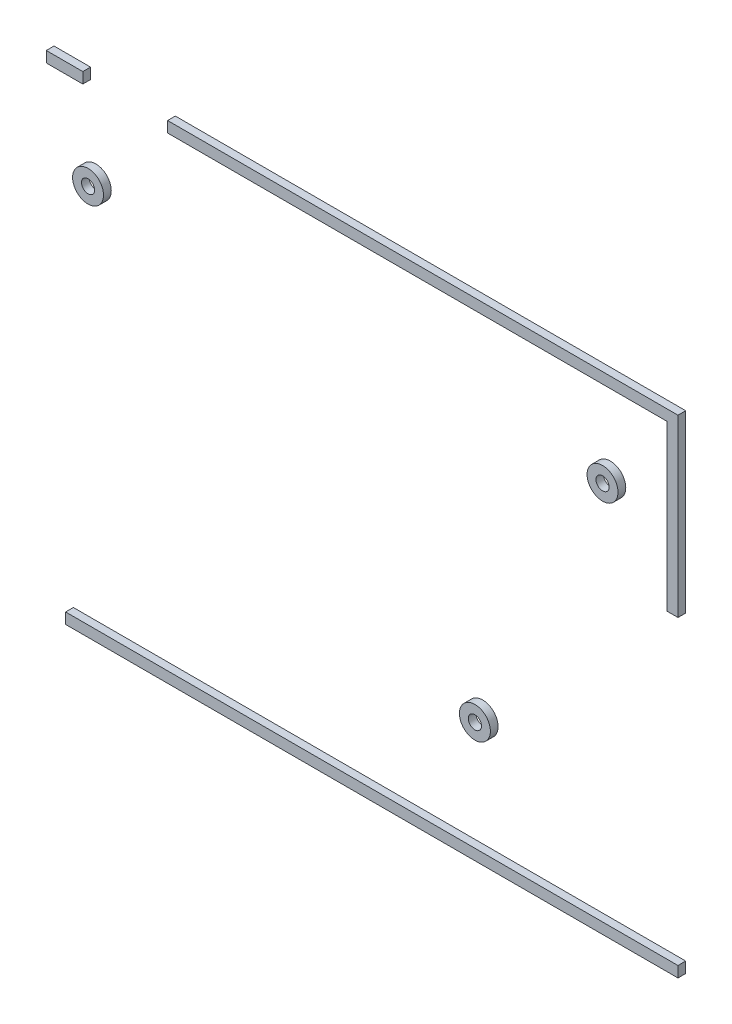
ISO-10303-21;
HEADER;
FILE_DESCRIPTION(('STEP AP214'),'2;1');
FILE_NAME('part.step','',(''),(''),'','','');
FILE_SCHEMA(('AUTOMOTIVE_DESIGN { 1 0 10303 214 1 1 1 1 }'));
ENDSEC;
DATA;
#1=APPLICATION_CONTEXT('core data for automotive mechanical design processes');
#2=APPLICATION_PROTOCOL_DEFINITION('international standard','automotive_design',2000,#1);
#3=PRODUCT_CONTEXT('',#1,'mechanical');
#4=PRODUCT('Part','Part','',(#3));
#5=PRODUCT_RELATED_PRODUCT_CATEGORY('part','',(#4));
#6=PRODUCT_DEFINITION_FORMATION('','',#4);
#7=PRODUCT_DEFINITION_CONTEXT('part definition',#1,'design');
#8=PRODUCT_DEFINITION('design','',#6,#7);
#9=PRODUCT_DEFINITION_SHAPE('','',#8);
#10=(LENGTH_UNIT() NAMED_UNIT(*) SI_UNIT(.MILLI.,.METRE.));
#11=(NAMED_UNIT(*) PLANE_ANGLE_UNIT() SI_UNIT($,.RADIAN.));
#12=(NAMED_UNIT(*) SI_UNIT($,.STERADIAN.) SOLID_ANGLE_UNIT());
#13=UNCERTAINTY_MEASURE_WITH_UNIT(LENGTH_MEASURE(1.E-05),#10,'distance_accuracy_value','');
#14=(GEOMETRIC_REPRESENTATION_CONTEXT(3) GLOBAL_UNCERTAINTY_ASSIGNED_CONTEXT((#13)) GLOBAL_UNIT_ASSIGNED_CONTEXT((#10,
#11,#12)) REPRESENTATION_CONTEXT('',''));
#15=CARTESIAN_POINT('',(0.,0.,0.));
#16=DIRECTION('',(0.,0.,1.));
#17=DIRECTION('',(1.,0.,0.));
#18=AXIS2_PLACEMENT_3D('',#15,#16,#17);
#19=CARTESIAN_POINT('',(176.,0.,160.32476117146));
#20=DIRECTION('',(1.,0.,0.));
#21=DIRECTION('',(0.,0.,-1.));
#22=AXIS2_PLACEMENT_3D('',#19,#20,#21);
#23=PLANE('',#22);
#24=DIRECTION('',(0.,0.,-1.));
#25=VECTOR('',#24,1.);
#26=CARTESIAN_POINT('',(176.,-60.2,160.32476117146));
#27=LINE('',#26,#25);
#28=CARTESIAN_POINT('',(176.,-60.2,2.));
#29=VERTEX_POINT('',#28);
#30=CARTESIAN_POINT('',(176.,-60.2,0.));
#31=VERTEX_POINT('',#30);
#32=EDGE_CURVE('E109',#29,#31,#27,.T.);
#33=ORIENTED_EDGE('',*,*,#32,.F.);
#34=DIRECTION('',(0.,1.,0.));
#35=VECTOR('',#34,1.);
#36=CARTESIAN_POINT('',(176.,0.,2.));
#37=LINE('',#36,#35);
#38=CARTESIAN_POINT('',(176.,-63.,2.));
#39=VERTEX_POINT('',#38);
#40=EDGE_CURVE('E68',#29,#39,#37,.F.);
#41=ORIENTED_EDGE('',*,*,#40,.T.);
#42=DIRECTION('',(0.,0.,-1.));
#43=VECTOR('',#42,1.);
#44=CARTESIAN_POINT('',(176.,-63.,160.32476117146));
#45=LINE('',#44,#43);
#46=CARTESIAN_POINT('',(176.,-63.,0.));
#47=VERTEX_POINT('',#46);
#48=EDGE_CURVE('E107',#39,#47,#45,.T.);
#49=ORIENTED_EDGE('',*,*,#48,.T.);
#50=DIRECTION('',(0.,-1.,0.));
#51=VECTOR('',#50,1.);
#52=CARTESIAN_POINT('',(176.,0.,0.));
#53=LINE('',#52,#51);
#54=EDGE_CURVE('E123',#31,#47,#53,.T.);
#55=ORIENTED_EDGE('',*,*,#54,.F.);
#56=EDGE_LOOP('',(#33,#41,#49,#55));
#57=FACE_BOUND('',#56,.T.);
#58=ADVANCED_FACE('F64',(#57),#23,.T.);
#59=CARTESIAN_POINT('',(0.,-60.2,160.32476117146));
#60=DIRECTION('',(0.,1.,0.));
#61=DIRECTION('',(0.,0.,1.));
#62=AXIS2_PLACEMENT_3D('',#59,#60,#61);
#63=PLANE('',#62);
#64=DIRECTION('',(0.,0.,-1.));
#65=VECTOR('',#64,1.);
#66=CARTESIAN_POINT('',(17.7,-60.2,160.32476117146));
#67=LINE('',#66,#65);
#68=CARTESIAN_POINT('',(17.7,-60.2,2.));
#69=VERTEX_POINT('',#68);
#70=CARTESIAN_POINT('',(17.7,-60.2,0.));
#71=VERTEX_POINT('',#70);
#72=EDGE_CURVE('E133',#69,#71,#67,.T.);
#73=ORIENTED_EDGE('',*,*,#72,.F.);
#74=DIRECTION('',(1.,0.,0.));
#75=VECTOR('',#74,1.);
#76=CARTESIAN_POINT('',(0.,-60.2,2.));
#77=LINE('',#76,#75);
#78=EDGE_CURVE('E83',#69,#29,#77,.T.);
#79=ORIENTED_EDGE('',*,*,#78,.T.);
#80=ORIENTED_EDGE('',*,*,#32,.T.);
#81=DIRECTION('',(1.,0.,0.));
#82=VECTOR('',#81,1.);
#83=CARTESIAN_POINT('',(0.,-60.2,0.));
#84=LINE('',#83,#82);
#85=EDGE_CURVE('E121',#71,#31,#84,.T.);
#86=ORIENTED_EDGE('',*,*,#85,.F.);
#87=EDGE_LOOP('',(#73,#79,#80,#86));
#88=FACE_BOUND('',#87,.T.);
#89=ADVANCED_FACE('F136',(#88),#63,.T.);
#90=CARTESIAN_POINT('',(17.7,0.,160.32476117146));
#91=DIRECTION('',(1.,0.,0.));
#92=DIRECTION('',(0.,0.,-1.));
#93=AXIS2_PLACEMENT_3D('',#90,#91,#92);
#94=PLANE('',#93);
#95=DIRECTION('',(0.,-1.,0.));
#96=VECTOR('',#95,1.);
#97=CARTESIAN_POINT('',(17.7,0.,2.));
#98=LINE('',#97,#96);
#99=CARTESIAN_POINT('',(17.7,-63.,2.));
#100=VERTEX_POINT('',#99);
#101=EDGE_CURVE('E75',#69,#100,#98,.T.);
#102=ORIENTED_EDGE('',*,*,#101,.F.);
#103=ORIENTED_EDGE('',*,*,#72,.T.);
#104=DIRECTION('',(0.,-1.,0.));
#105=VECTOR('',#104,1.);
#106=CARTESIAN_POINT('',(17.7,0.,0.));
#107=LINE('',#106,#105);
#108=CARTESIAN_POINT('',(17.7,-63.,0.));
#109=VERTEX_POINT('',#108);
#110=EDGE_CURVE('E130',#71,#109,#107,.T.);
#111=ORIENTED_EDGE('',*,*,#110,.T.);
#112=DIRECTION('',(0.,0.,-1.));
#113=VECTOR('',#112,1.);
#114=CARTESIAN_POINT('',(17.7,-63.,160.32476117146));
#115=LINE('',#114,#113);
#116=EDGE_CURVE('E118',#100,#109,#115,.T.);
#117=ORIENTED_EDGE('',*,*,#116,.F.);
#118=EDGE_LOOP('',(#102,#103,#111,#117));
#119=FACE_BOUND('',#118,.T.);
#120=ADVANCED_FACE('F140',(#119),#94,.F.);
#121=CARTESIAN_POINT('',(0.,-63.,160.32476117146));
#122=DIRECTION('',(0.,1.,0.));
#123=DIRECTION('',(0.,0.,1.));
#124=AXIS2_PLACEMENT_3D('',#121,#122,#123);
#125=PLANE('',#124);
#126=DIRECTION('',(1.,0.,0.));
#127=VECTOR('',#126,1.);
#128=CARTESIAN_POINT('',(-0.103234931084,-63.,1.99999999999999));
#129=LINE('',#128,#127);
#130=EDGE_CURVE('E13',#100,#39,#129,.T.);
#131=ORIENTED_EDGE('',*,*,#130,.F.);
#132=ORIENTED_EDGE('',*,*,#116,.T.);
#133=DIRECTION('',(1.,0.,0.));
#134=VECTOR('',#133,1.);
#135=CARTESIAN_POINT('',(0.,-63.,0.));
#136=LINE('',#135,#134);
#137=EDGE_CURVE('E113',#109,#47,#136,.T.);
#138=ORIENTED_EDGE('',*,*,#137,.T.);
#139=ORIENTED_EDGE('',*,*,#48,.F.);
#140=EDGE_LOOP('',(#131,#132,#138,#139));
#141=FACE_BOUND('',#140,.T.);
#142=ADVANCED_FACE('F111',(#141),#125,.F.);
#143=CARTESIAN_POINT('',(0.,0.,0.));
#144=DIRECTION('',(0.,0.,1.));
#145=DIRECTION('',(1.,0.,0.));
#146=AXIS2_PLACEMENT_3D('',#143,#144,#145);
#147=PLANE('',#146);
#148=ORIENTED_EDGE('',*,*,#54,.T.);
#149=ORIENTED_EDGE('',*,*,#137,.F.);
#150=ORIENTED_EDGE('',*,*,#110,.F.);
#151=ORIENTED_EDGE('',*,*,#85,.T.);
#152=EDGE_LOOP('',(#148,#149,#150,#151));
#153=FACE_BOUND('',#152,.T.);
#154=ADVANCED_FACE('F137',(#153),#147,.F.);
#155=CARTESIAN_POINT('',(-0.103234931084,0.02377597202222,1.99999999999999));
#156=DIRECTION('',(0.,0.,1.));
#157=DIRECTION('',(1.,0.,0.));
#158=AXIS2_PLACEMENT_3D('',#155,#156,#157);
#159=PLANE('',#158);
#160=ORIENTED_EDGE('',*,*,#101,.T.);
#161=ORIENTED_EDGE('',*,*,#130,.T.);
#162=ORIENTED_EDGE('',*,*,#40,.F.);
#163=ORIENTED_EDGE('',*,*,#78,.F.);
#164=EDGE_LOOP('',(#160,#161,#162,#163));
#165=FACE_BOUND('',#164,.T.);
#166=ADVANCED_FACE('F66',(#165),#159,.T.);
#167=CLOSED_SHELL('',(#58,#89,#120,#142,#154,#166));
#168=MANIFOLD_SOLID_BREP('B2',#167);
#169=CARTESIAN_POINT('',(123.5,-32.,160.32476117146));
#170=DIRECTION('',(0.,0.,-1.));
#171=DIRECTION('',(-1.,0.,0.));
#172=AXIS2_PLACEMENT_3D('',#169,#170,#171);
#173=CYLINDRICAL_SURFACE('',#172,1.70000000000001);
#174=CARTESIAN_POINT('',(123.5,-32.,0.));
#175=DIRECTION('',(0.,0.,1.));
#176=DIRECTION('',(1.,0.,0.));
#177=AXIS2_PLACEMENT_3D('',#174,#175,#176);
#178=CIRCLE('',#177,1.70000000000001);
#179=CARTESIAN_POINT('',(125.2,-32.,0.));
#180=VERTEX_POINT('',#179);
#181=EDGE_CURVE('E210',#180,#180,#178,.T.);
#182=ORIENTED_EDGE('',*,*,#181,.F.);
#183=EDGE_LOOP('',(#182));
#184=FACE_BOUND('',#183,.T.);
#185=CARTESIAN_POINT('',(123.5,-32.,2.));
#186=DIRECTION('',(0.,0.,1.));
#187=DIRECTION('',(1.,0.,0.));
#188=AXIS2_PLACEMENT_3D('',#185,#186,#187);
#189=CIRCLE('',#188,1.70000000000001);
#190=CARTESIAN_POINT('',(125.2,-32.,2.));
#191=VERTEX_POINT('',#190);
#192=EDGE_CURVE('E219',#191,#191,#189,.T.);
#193=ORIENTED_EDGE('',*,*,#192,.T.);
#194=EDGE_LOOP('',(#193));
#195=FACE_BOUND('',#194,.T.);
#196=ADVANCED_FACE('F203',(#184,#195),#173,.F.);
#197=CARTESIAN_POINT('',(123.5,-32.,160.32476117146));
#198=DIRECTION('',(0.,0.,-1.));
#199=DIRECTION('',(-1.,0.,0.));
#200=AXIS2_PLACEMENT_3D('',#197,#198,#199);
#201=CYLINDRICAL_SURFACE('',#200,3.99999999999999);
#202=CARTESIAN_POINT('',(123.5,-32.,0.));
#203=DIRECTION('',(0.,0.,1.));
#204=DIRECTION('',(1.,0.,0.));
#205=AXIS2_PLACEMENT_3D('',#202,#203,#204);
#206=CIRCLE('',#205,3.99999999999999);
#207=CARTESIAN_POINT('',(127.5,-32.,0.));
#208=VERTEX_POINT('',#207);
#209=EDGE_CURVE('E214',#208,#208,#206,.T.);
#210=ORIENTED_EDGE('',*,*,#209,.T.);
#211=EDGE_LOOP('',(#210));
#212=FACE_BOUND('',#211,.T.);
#213=CARTESIAN_POINT('',(123.5,-32.,2.));
#214=DIRECTION('',(0.,0.,1.));
#215=DIRECTION('',(1.,0.,0.));
#216=AXIS2_PLACEMENT_3D('',#213,#214,#215);
#217=CIRCLE('',#216,3.99999999999999);
#218=CARTESIAN_POINT('',(127.5,-32.,2.));
#219=VERTEX_POINT('',#218);
#220=EDGE_CURVE('E63',#219,#219,#217,.T.);
#221=ORIENTED_EDGE('',*,*,#220,.F.);
#222=EDGE_LOOP('',(#221));
#223=FACE_BOUND('',#222,.T.);
#224=ADVANCED_FACE('F230',(#212,#223),#201,.T.);
#225=CARTESIAN_POINT('',(0.,0.,0.));
#226=DIRECTION('',(0.,0.,1.));
#227=DIRECTION('',(1.,0.,0.));
#228=AXIS2_PLACEMENT_3D('',#225,#226,#227);
#229=PLANE('',#228);
#230=ORIENTED_EDGE('',*,*,#181,.T.);
#231=EDGE_LOOP('',(#230));
#232=FACE_BOUND('',#231,.T.);
#233=ORIENTED_EDGE('',*,*,#209,.F.);
#234=EDGE_LOOP('',(#233));
#235=FACE_BOUND('',#234,.T.);
#236=ADVANCED_FACE('F226',(#232,#235),#229,.F.);
#237=CARTESIAN_POINT('',(-0.103234931084,0.02377597202222,1.99999999999999));
#238=DIRECTION('',(0.,0.,1.));
#239=DIRECTION('',(1.,0.,0.));
#240=AXIS2_PLACEMENT_3D('',#237,#238,#239);
#241=PLANE('',#240);
#242=ORIENTED_EDGE('',*,*,#192,.F.);
#243=EDGE_LOOP('',(#242));
#244=FACE_BOUND('',#243,.T.);
#245=ORIENTED_EDGE('',*,*,#220,.T.);
#246=EDGE_LOOP('',(#245));
#247=FACE_BOUND('',#246,.T.);
#248=ADVANCED_FACE('F205',(#244,#247),#241,.T.);
#249=CLOSED_SHELL('',(#196,#224,#236,#248));
#250=MANIFOLD_SOLID_BREP('B7',#249);
#251=CARTESIAN_POINT('',(156.5,38.,160.32476117146));
#252=DIRECTION('',(0.,0.,-1.));
#253=DIRECTION('',(-1.,0.,0.));
#254=AXIS2_PLACEMENT_3D('',#251,#252,#253);
#255=CYLINDRICAL_SURFACE('',#254,1.70000000000001);
#256=CARTESIAN_POINT('',(156.5,38.,0.));
#257=DIRECTION('',(0.,0.,1.));
#258=DIRECTION('',(1.,0.,0.));
#259=AXIS2_PLACEMENT_3D('',#256,#257,#258);
#260=CIRCLE('',#259,1.70000000000001);
#261=CARTESIAN_POINT('',(158.2,38.,0.));
#262=VERTEX_POINT('',#261);
#263=EDGE_CURVE('E281',#262,#262,#260,.T.);
#264=ORIENTED_EDGE('',*,*,#263,.F.);
#265=EDGE_LOOP('',(#264));
#266=FACE_BOUND('',#265,.T.);
#267=CARTESIAN_POINT('',(156.5,38.,2.));
#268=DIRECTION('',(0.,0.,1.));
#269=DIRECTION('',(1.,0.,0.));
#270=AXIS2_PLACEMENT_3D('',#267,#268,#269);
#271=CIRCLE('',#270,1.70000000000001);
#272=CARTESIAN_POINT('',(158.2,38.,2.));
#273=VERTEX_POINT('',#272);
#274=EDGE_CURVE('E290',#273,#273,#271,.T.);
#275=ORIENTED_EDGE('',*,*,#274,.T.);
#276=EDGE_LOOP('',(#275));
#277=FACE_BOUND('',#276,.T.);
#278=ADVANCED_FACE('F274',(#266,#277),#255,.F.);
#279=CARTESIAN_POINT('',(156.5,38.,160.32476117146));
#280=DIRECTION('',(0.,0.,-1.));
#281=DIRECTION('',(-1.,0.,0.));
#282=AXIS2_PLACEMENT_3D('',#279,#280,#281);
#283=CYLINDRICAL_SURFACE('',#282,3.99999999999999);
#284=CARTESIAN_POINT('',(156.5,38.,0.));
#285=DIRECTION('',(0.,0.,1.));
#286=DIRECTION('',(1.,0.,0.));
#287=AXIS2_PLACEMENT_3D('',#284,#285,#286);
#288=CIRCLE('',#287,3.99999999999999);
#289=CARTESIAN_POINT('',(160.5,38.,0.));
#290=VERTEX_POINT('',#289);
#291=EDGE_CURVE('E285',#290,#290,#288,.T.);
#292=ORIENTED_EDGE('',*,*,#291,.T.);
#293=EDGE_LOOP('',(#292));
#294=FACE_BOUND('',#293,.T.);
#295=CARTESIAN_POINT('',(156.5,38.,2.));
#296=DIRECTION('',(0.,0.,1.));
#297=DIRECTION('',(1.,0.,0.));
#298=AXIS2_PLACEMENT_3D('',#295,#296,#297);
#299=CIRCLE('',#298,3.99999999999999);
#300=CARTESIAN_POINT('',(160.5,38.,2.));
#301=VERTEX_POINT('',#300);
#302=EDGE_CURVE('E202',#301,#301,#299,.T.);
#303=ORIENTED_EDGE('',*,*,#302,.F.);
#304=EDGE_LOOP('',(#303));
#305=FACE_BOUND('',#304,.T.);
#306=ADVANCED_FACE('F301',(#294,#305),#283,.T.);
#307=CARTESIAN_POINT('',(0.,0.,0.));
#308=DIRECTION('',(0.,0.,1.));
#309=DIRECTION('',(1.,0.,0.));
#310=AXIS2_PLACEMENT_3D('',#307,#308,#309);
#311=PLANE('',#310);
#312=ORIENTED_EDGE('',*,*,#263,.T.);
#313=EDGE_LOOP('',(#312));
#314=FACE_BOUND('',#313,.T.);
#315=ORIENTED_EDGE('',*,*,#291,.F.);
#316=EDGE_LOOP('',(#315));
#317=FACE_BOUND('',#316,.T.);
#318=ADVANCED_FACE('F297',(#314,#317),#311,.F.);
#319=CARTESIAN_POINT('',(-0.103234931084,0.02377597202222,1.99999999999999));
#320=DIRECTION('',(0.,0.,1.));
#321=DIRECTION('',(1.,0.,0.));
#322=AXIS2_PLACEMENT_3D('',#319,#320,#321);
#323=PLANE('',#322);
#324=ORIENTED_EDGE('',*,*,#274,.F.);
#325=EDGE_LOOP('',(#324));
#326=FACE_BOUND('',#325,.T.);
#327=ORIENTED_EDGE('',*,*,#302,.T.);
#328=EDGE_LOOP('',(#327));
#329=FACE_BOUND('',#328,.T.);
#330=ADVANCED_FACE('F276',(#326,#329),#323,.T.);
#331=CLOSED_SHELL('',(#278,#306,#318,#330));
#332=MANIFOLD_SOLID_BREP('B58',#331);
#333=CARTESIAN_POINT('',(0.,63.,160.32476117146));
#334=DIRECTION('',(0.,-1.,0.));
#335=DIRECTION('',(0.,0.,-1.));
#336=AXIS2_PLACEMENT_3D('',#333,#334,#335);
#337=PLANE('',#336);
#338=DIRECTION('',(1.,0.,0.));
#339=VECTOR('',#338,1.);
#340=CARTESIAN_POINT('',(-0.103234931084,63.,1.99999999999999));
#341=LINE('',#340,#339);
#342=CARTESIAN_POINT('',(176.,63.,1.99999999999999));
#343=VERTEX_POINT('',#342);
#344=CARTESIAN_POINT('',(44.0607929126358,63.,2.));
#345=VERTEX_POINT('',#344);
#346=EDGE_CURVE('E272',#343,#345,#341,.F.);
#347=ORIENTED_EDGE('',*,*,#346,.F.);
#348=DIRECTION('',(0.,0.,-1.));
#349=VECTOR('',#348,1.);
#350=CARTESIAN_POINT('',(176.,63.,160.32476117146));
#351=LINE('',#350,#349);
#352=CARTESIAN_POINT('',(176.,63.,0.));
#353=VERTEX_POINT('',#352);
#354=EDGE_CURVE('E427',#343,#353,#351,.T.);
#355=ORIENTED_EDGE('',*,*,#354,.T.);
#356=DIRECTION('',(-1.,0.,0.));
#357=VECTOR('',#356,1.);
#358=CARTESIAN_POINT('',(0.,63.,0.));
#359=LINE('',#358,#357);
#360=CARTESIAN_POINT('',(44.0607929126358,63.,0.));
#361=VERTEX_POINT('',#360);
#362=EDGE_CURVE('E416',#353,#361,#359,.T.);
#363=ORIENTED_EDGE('',*,*,#362,.T.);
#364=DIRECTION('',(0.,0.,-1.));
#365=VECTOR('',#364,1.);
#366=CARTESIAN_POINT('',(44.0607929126358,63.,160.32476117146));
#367=LINE('',#366,#365);
#368=EDGE_CURVE('E422',#345,#361,#367,.T.);
#369=ORIENTED_EDGE('',*,*,#368,.F.);
#370=EDGE_LOOP('',(#347,#355,#363,#369));
#371=FACE_BOUND('',#370,.T.);
#372=ADVANCED_FACE('F343',(#371),#337,.F.);
#373=CARTESIAN_POINT('',(44.0607929126358,0.,160.32476117146));
#374=DIRECTION('',(1.,0.,0.));
#375=DIRECTION('',(0.,0.,-1.));
#376=AXIS2_PLACEMENT_3D('',#373,#374,#375);
#377=PLANE('',#376);
#378=DIRECTION('',(0.,-1.,0.));
#379=VECTOR('',#378,1.);
#380=CARTESIAN_POINT('',(44.0607929126358,0.,2.));
#381=LINE('',#380,#379);
#382=CARTESIAN_POINT('',(44.0607929126358,60.2,2.));
#383=VERTEX_POINT('',#382);
#384=EDGE_CURVE('E389',#345,#383,#381,.T.);
#385=ORIENTED_EDGE('',*,*,#384,.F.);
#386=ORIENTED_EDGE('',*,*,#368,.T.);
#387=DIRECTION('',(0.,-1.,0.));
#388=VECTOR('',#387,1.);
#389=CARTESIAN_POINT('',(44.0607929126358,0.,0.));
#390=LINE('',#389,#388);
#391=CARTESIAN_POINT('',(44.0607929126358,60.2,0.));
#392=VERTEX_POINT('',#391);
#393=EDGE_CURVE('E406',#361,#392,#390,.T.);
#394=ORIENTED_EDGE('',*,*,#393,.T.);
#395=DIRECTION('',(0.,0.,-1.));
#396=VECTOR('',#395,1.);
#397=CARTESIAN_POINT('',(44.0607929126358,60.2,160.32476117146));
#398=LINE('',#397,#396);
#399=EDGE_CURVE('E403',#383,#392,#398,.T.);
#400=ORIENTED_EDGE('',*,*,#399,.F.);
#401=EDGE_LOOP('',(#385,#386,#394,#400));
#402=FACE_BOUND('',#401,.T.);
#403=ADVANCED_FACE('F408',(#402),#377,.F.);
#404=CARTESIAN_POINT('',(0.,60.2,160.32476117146));
#405=DIRECTION('',(0.,-1.,0.));
#406=DIRECTION('',(0.,0.,-1.));
#407=AXIS2_PLACEMENT_3D('',#404,#405,#406);
#408=PLANE('',#407);
#409=DIRECTION('',(0.,0.,-1.));
#410=VECTOR('',#409,1.);
#411=CARTESIAN_POINT('',(173.2,60.2,160.32476117146));
#412=LINE('',#411,#410);
#413=CARTESIAN_POINT('',(173.2,60.2,2.));
#414=VERTEX_POINT('',#413);
#415=CARTESIAN_POINT('',(173.2,60.2,0.));
#416=VERTEX_POINT('',#415);
#417=EDGE_CURVE('E405',#414,#416,#412,.T.);
#418=ORIENTED_EDGE('',*,*,#417,.F.);
#419=DIRECTION('',(-1.,0.,0.));
#420=VECTOR('',#419,1.);
#421=CARTESIAN_POINT('',(0.,60.2,2.));
#422=LINE('',#421,#420);
#423=EDGE_CURVE('E391',#414,#383,#422,.T.);
#424=ORIENTED_EDGE('',*,*,#423,.T.);
#425=ORIENTED_EDGE('',*,*,#399,.T.);
#426=DIRECTION('',(-1.,0.,0.));
#427=VECTOR('',#426,1.);
#428=CARTESIAN_POINT('',(0.,60.2,0.));
#429=LINE('',#428,#427);
#430=EDGE_CURVE('E397',#416,#392,#429,.T.);
#431=ORIENTED_EDGE('',*,*,#430,.F.);
#432=EDGE_LOOP('',(#418,#424,#425,#431));
#433=FACE_BOUND('',#432,.T.);
#434=ADVANCED_FACE('F401',(#433),#408,.T.);
#435=CARTESIAN_POINT('',(173.2,0.,160.32476117146));
#436=DIRECTION('',(-1.,0.,0.));
#437=DIRECTION('',(0.,0.,1.));
#438=AXIS2_PLACEMENT_3D('',#435,#436,#437);
#439=PLANE('',#438);
#440=DIRECTION('',(0.,0.,-1.));
#441=VECTOR('',#440,1.);
#442=CARTESIAN_POINT('',(173.2,17.7,160.32476117146));
#443=LINE('',#442,#441);
#444=CARTESIAN_POINT('',(173.2,17.7,2.));
#445=VERTEX_POINT('',#444);
#446=CARTESIAN_POINT('',(173.2,17.7,0.));
#447=VERTEX_POINT('',#446);
#448=EDGE_CURVE('E419',#445,#447,#443,.T.);
#449=ORIENTED_EDGE('',*,*,#448,.F.);
#450=DIRECTION('',(0.,1.,0.));
#451=VECTOR('',#450,1.);
#452=CARTESIAN_POINT('',(173.2,0.,2.));
#453=LINE('',#452,#451);
#454=EDGE_CURVE('E411',#445,#414,#453,.T.);
#455=ORIENTED_EDGE('',*,*,#454,.T.);
#456=ORIENTED_EDGE('',*,*,#417,.T.);
#457=DIRECTION('',(0.,1.,0.));
#458=VECTOR('',#457,1.);
#459=CARTESIAN_POINT('',(173.2,0.,0.));
#460=LINE('',#459,#458);
#461=EDGE_CURVE('E456',#447,#416,#460,.T.);
#462=ORIENTED_EDGE('',*,*,#461,.F.);
#463=EDGE_LOOP('',(#449,#455,#456,#462));
#464=FACE_BOUND('',#463,.T.);
#465=ADVANCED_FACE('F461',(#464),#439,.T.);
#466=CARTESIAN_POINT('',(0.,17.7,160.32476117146));
#467=DIRECTION('',(0.,1.,0.));
#468=DIRECTION('',(0.,0.,1.));
#469=AXIS2_PLACEMENT_3D('',#466,#467,#468);
#470=PLANE('',#469);
#471=DIRECTION('',(1.,0.,0.));
#472=VECTOR('',#471,1.);
#473=CARTESIAN_POINT('',(0.,17.7,2.));
#474=LINE('',#473,#472);
#475=CARTESIAN_POINT('',(176.,17.7,2.));
#476=VERTEX_POINT('',#475);
#477=EDGE_CURVE('E396',#445,#476,#474,.T.);
#478=ORIENTED_EDGE('',*,*,#477,.F.);
#479=ORIENTED_EDGE('',*,*,#448,.T.);
#480=DIRECTION('',(1.,0.,0.));
#481=VECTOR('',#480,1.);
#482=CARTESIAN_POINT('',(0.,17.7,0.));
#483=LINE('',#482,#481);
#484=CARTESIAN_POINT('',(176.,17.7,0.));
#485=VERTEX_POINT('',#484);
#486=EDGE_CURVE('E420',#447,#485,#483,.T.);
#487=ORIENTED_EDGE('',*,*,#486,.T.);
#488=DIRECTION('',(0.,0.,-1.));
#489=VECTOR('',#488,1.);
#490=CARTESIAN_POINT('',(176.,17.7,160.32476117146));
#491=LINE('',#490,#489);
#492=EDGE_CURVE('E424',#476,#485,#491,.T.);
#493=ORIENTED_EDGE('',*,*,#492,.F.);
#494=EDGE_LOOP('',(#478,#479,#487,#493));
#495=FACE_BOUND('',#494,.T.);
#496=ADVANCED_FACE('F441',(#495),#470,.F.);
#497=CARTESIAN_POINT('',(176.,0.,160.32476117146));
#498=DIRECTION('',(-1.,0.,0.));
#499=DIRECTION('',(0.,0.,1.));
#500=AXIS2_PLACEMENT_3D('',#497,#498,#499);
#501=PLANE('',#500);
#502=DIRECTION('',(0.,1.,0.));
#503=VECTOR('',#502,1.);
#504=CARTESIAN_POINT('',(176.,0.02377597202222,1.99999999999999));
#505=LINE('',#504,#503);
#506=EDGE_CURVE('E352',#476,#343,#505,.T.);
#507=ORIENTED_EDGE('',*,*,#506,.F.);
#508=ORIENTED_EDGE('',*,*,#492,.T.);
#509=DIRECTION('',(0.,1.,0.));
#510=VECTOR('',#509,1.);
#511=CARTESIAN_POINT('',(176.,0.,0.));
#512=LINE('',#511,#510);
#513=EDGE_CURVE('E426',#485,#353,#512,.T.);
#514=ORIENTED_EDGE('',*,*,#513,.T.);
#515=ORIENTED_EDGE('',*,*,#354,.F.);
#516=EDGE_LOOP('',(#507,#508,#514,#515));
#517=FACE_BOUND('',#516,.T.);
#518=ADVANCED_FACE('F447',(#517),#501,.F.);
#519=CARTESIAN_POINT('',(0.,0.,0.));
#520=DIRECTION('',(0.,0.,1.));
#521=DIRECTION('',(1.,0.,0.));
#522=AXIS2_PLACEMENT_3D('',#519,#520,#521);
#523=PLANE('',#522);
#524=ORIENTED_EDGE('',*,*,#362,.F.);
#525=ORIENTED_EDGE('',*,*,#513,.F.);
#526=ORIENTED_EDGE('',*,*,#486,.F.);
#527=ORIENTED_EDGE('',*,*,#461,.T.);
#528=ORIENTED_EDGE('',*,*,#430,.T.);
#529=ORIENTED_EDGE('',*,*,#393,.F.);
#530=EDGE_LOOP('',(#524,#525,#526,#527,#528,#529));
#531=FACE_BOUND('',#530,.T.);
#532=ADVANCED_FACE('F452',(#531),#523,.F.);
#533=CARTESIAN_POINT('',(-0.103234931084,0.02377597202222,1.99999999999999));
#534=DIRECTION('',(0.,0.,1.));
#535=DIRECTION('',(1.,0.,0.));
#536=AXIS2_PLACEMENT_3D('',#533,#534,#535);
#537=PLANE('',#536);
#538=ORIENTED_EDGE('',*,*,#384,.T.);
#539=ORIENTED_EDGE('',*,*,#423,.F.);
#540=ORIENTED_EDGE('',*,*,#454,.F.);
#541=ORIENTED_EDGE('',*,*,#477,.T.);
#542=ORIENTED_EDGE('',*,*,#506,.T.);
#543=ORIENTED_EDGE('',*,*,#346,.T.);
#544=EDGE_LOOP('',(#538,#539,#540,#541,#542,#543));
#545=FACE_BOUND('',#544,.T.);
#546=ADVANCED_FACE('F345',(#545),#537,.T.);
#547=CLOSED_SHELL('',(#372,#403,#434,#465,#496,#518,#532,#546));
#548=MANIFOLD_SOLID_BREP('B197',#547);
#549=CARTESIAN_POINT('',(23.5,38.,160.32476117146));
#550=DIRECTION('',(0.,0.,-1.));
#551=DIRECTION('',(-1.,0.,0.));
#552=AXIS2_PLACEMENT_3D('',#549,#550,#551);
#553=CYLINDRICAL_SURFACE('',#552,1.7);
#554=CARTESIAN_POINT('',(23.5,38.,0.));
#555=DIRECTION('',(0.,0.,1.));
#556=DIRECTION('',(1.,0.,0.));
#557=AXIS2_PLACEMENT_3D('',#554,#555,#556);
#558=CIRCLE('',#557,1.7);
#559=CARTESIAN_POINT('',(25.2,38.,0.));
#560=VERTEX_POINT('',#559);
#561=EDGE_CURVE('E551',#560,#560,#558,.T.);
#562=ORIENTED_EDGE('',*,*,#561,.F.);
#563=EDGE_LOOP('',(#562));
#564=FACE_BOUND('',#563,.T.);
#565=CARTESIAN_POINT('',(23.5,38.,2.));
#566=DIRECTION('',(0.,0.,1.));
#567=DIRECTION('',(1.,0.,0.));
#568=AXIS2_PLACEMENT_3D('',#565,#566,#567);
#569=CIRCLE('',#568,1.7);
#570=CARTESIAN_POINT('',(25.2,38.,2.));
#571=VERTEX_POINT('',#570);
#572=EDGE_CURVE('E560',#571,#571,#569,.T.);
#573=ORIENTED_EDGE('',*,*,#572,.T.);
#574=EDGE_LOOP('',(#573));
#575=FACE_BOUND('',#574,.T.);
#576=ADVANCED_FACE('F544',(#564,#575),#553,.F.);
#577=CARTESIAN_POINT('',(23.5,38.,160.32476117146));
#578=DIRECTION('',(0.,0.,-1.));
#579=DIRECTION('',(-1.,0.,0.));
#580=AXIS2_PLACEMENT_3D('',#577,#578,#579);
#581=CYLINDRICAL_SURFACE('',#580,4.);
#582=CARTESIAN_POINT('',(23.5,38.,0.));
#583=DIRECTION('',(0.,0.,1.));
#584=DIRECTION('',(1.,0.,0.));
#585=AXIS2_PLACEMENT_3D('',#582,#583,#584);
#586=CIRCLE('',#585,4.);
#587=CARTESIAN_POINT('',(27.5,38.,0.));
#588=VERTEX_POINT('',#587);
#589=EDGE_CURVE('E555',#588,#588,#586,.T.);
#590=ORIENTED_EDGE('',*,*,#589,.T.);
#591=EDGE_LOOP('',(#590));
#592=FACE_BOUND('',#591,.T.);
#593=CARTESIAN_POINT('',(23.5,38.,2.));
#594=DIRECTION('',(0.,0.,1.));
#595=DIRECTION('',(1.,0.,0.));
#596=AXIS2_PLACEMENT_3D('',#593,#594,#595);
#597=CIRCLE('',#596,4.);
#598=CARTESIAN_POINT('',(27.5,38.,2.));
#599=VERTEX_POINT('',#598);
#600=EDGE_CURVE('E342',#599,#599,#597,.T.);
#601=ORIENTED_EDGE('',*,*,#600,.F.);
#602=EDGE_LOOP('',(#601));
#603=FACE_BOUND('',#602,.T.);
#604=ADVANCED_FACE('F571',(#592,#603),#581,.T.);
#605=CARTESIAN_POINT('',(0.,0.,0.));
#606=DIRECTION('',(0.,0.,1.));
#607=DIRECTION('',(1.,0.,0.));
#608=AXIS2_PLACEMENT_3D('',#605,#606,#607);
#609=PLANE('',#608);
#610=ORIENTED_EDGE('',*,*,#561,.T.);
#611=EDGE_LOOP('',(#610));
#612=FACE_BOUND('',#611,.T.);
#613=ORIENTED_EDGE('',*,*,#589,.F.);
#614=EDGE_LOOP('',(#613));
#615=FACE_BOUND('',#614,.T.);
#616=ADVANCED_FACE('F567',(#612,#615),#609,.F.);
#617=CARTESIAN_POINT('',(-0.103234931084,0.02377597202222,1.99999999999999));
#618=DIRECTION('',(0.,0.,1.));
#619=DIRECTION('',(1.,0.,0.));
#620=AXIS2_PLACEMENT_3D('',#617,#618,#619);
#621=PLANE('',#620);
#622=ORIENTED_EDGE('',*,*,#572,.F.);
#623=EDGE_LOOP('',(#622));
#624=FACE_BOUND('',#623,.T.);
#625=ORIENTED_EDGE('',*,*,#600,.T.);
#626=EDGE_LOOP('',(#625));
#627=FACE_BOUND('',#626,.T.);
#628=ADVANCED_FACE('F546',(#624,#627),#621,.T.);
#629=CLOSED_SHELL('',(#576,#604,#616,#628));
#630=MANIFOLD_SOLID_BREP('B266',#629);
#631=CARTESIAN_POINT('',(0.,0.,0.));
#632=DIRECTION('',(0.,0.,1.));
#633=DIRECTION('',(1.,0.,0.));
#634=AXIS2_PLACEMENT_3D('',#631,#632,#633);
#635=PLANE('',#634);
#636=DIRECTION('',(1.,0.,0.));
#637=VECTOR('',#636,1.);
#638=CARTESIAN_POINT('',(0.,60.2,0.));
#639=LINE('',#638,#637);
#640=CARTESIAN_POINT('',(12.7,60.2,0.));
#641=VERTEX_POINT('',#640);
#642=CARTESIAN_POINT('',(22.1392070873642,60.2,0.));
#643=VERTEX_POINT('',#642);
#644=EDGE_CURVE('E661',#641,#643,#639,.T.);
#645=ORIENTED_EDGE('',*,*,#644,.F.);
#646=DIRECTION('',(0.,1.,0.));
#647=VECTOR('',#646,1.);
#648=CARTESIAN_POINT('',(12.7,0.,0.));
#649=LINE('',#648,#647);
#650=CARTESIAN_POINT('',(12.7,63.,0.));
#651=VERTEX_POINT('',#650);
#652=EDGE_CURVE('E670',#641,#651,#649,.T.);
#653=ORIENTED_EDGE('',*,*,#652,.T.);
#654=DIRECTION('',(1.,0.,0.));
#655=VECTOR('',#654,1.);
#656=CARTESIAN_POINT('',(0.,63.,0.));
#657=LINE('',#656,#655);
#658=CARTESIAN_POINT('',(22.1392070873642,63.,0.));
#659=VERTEX_POINT('',#658);
#660=EDGE_CURVE('E664',#651,#659,#657,.T.);
#661=ORIENTED_EDGE('',*,*,#660,.T.);
#662=DIRECTION('',(0.,1.,0.));
#663=VECTOR('',#662,1.);
#664=CARTESIAN_POINT('',(22.1392070873642,0.,0.));
#665=LINE('',#664,#663);
#666=EDGE_CURVE('E655',#643,#659,#665,.T.);
#667=ORIENTED_EDGE('',*,*,#666,.F.);
#668=EDGE_LOOP('',(#645,#653,#661,#667));
#669=FACE_BOUND('',#668,.T.);
#670=ADVANCED_FACE('F605',(#669),#635,.F.);
#671=CARTESIAN_POINT('',(12.7,0.,160.32476117146));
#672=DIRECTION('',(-1.,0.,0.));
#673=DIRECTION('',(0.,0.,1.));
#674=AXIS2_PLACEMENT_3D('',#671,#672,#673);
#675=PLANE('',#674);
#676=DIRECTION('',(0.,0.,-1.));
#677=VECTOR('',#676,1.);
#678=CARTESIAN_POINT('',(12.7,60.2,160.32476117146));
#679=LINE('',#678,#677);
#680=CARTESIAN_POINT('',(12.7,60.2,2.));
#681=VERTEX_POINT('',#680);
#682=EDGE_CURVE('E639',#681,#641,#679,.T.);
#683=ORIENTED_EDGE('',*,*,#682,.F.);
#684=DIRECTION('',(0.,1.,0.));
#685=VECTOR('',#684,1.);
#686=CARTESIAN_POINT('',(12.7,0.,2.));
#687=LINE('',#686,#685);
#688=CARTESIAN_POINT('',(12.7,63.,2.));
#689=VERTEX_POINT('',#688);
#690=EDGE_CURVE('E626',#681,#689,#687,.T.);
#691=ORIENTED_EDGE('',*,*,#690,.T.);
#692=DIRECTION('',(0.,0.,-1.));
#693=VECTOR('',#692,1.);
#694=CARTESIAN_POINT('',(12.7,63.,160.32476117146));
#695=LINE('',#694,#693);
#696=EDGE_CURVE('E673',#689,#651,#695,.T.);
#697=ORIENTED_EDGE('',*,*,#696,.T.);
#698=ORIENTED_EDGE('',*,*,#652,.F.);
#699=EDGE_LOOP('',(#683,#691,#697,#698));
#700=FACE_BOUND('',#699,.T.);
#701=ADVANCED_FACE('F681',(#700),#675,.T.);
#702=CARTESIAN_POINT('',(0.,63.,160.32476117146));
#703=DIRECTION('',(0.,1.,0.));
#704=DIRECTION('',(0.,0.,1.));
#705=AXIS2_PLACEMENT_3D('',#702,#703,#704);
#706=PLANE('',#705);
#707=ORIENTED_EDGE('',*,*,#696,.F.);
#708=DIRECTION('',(1.,0.,0.));
#709=VECTOR('',#708,1.);
#710=CARTESIAN_POINT('',(0.,63.,2.));
#711=LINE('',#710,#709);
#712=CARTESIAN_POINT('',(22.1392070873642,63.,2.));
#713=VERTEX_POINT('',#712);
#714=EDGE_CURVE('E609',#689,#713,#711,.T.);
#715=ORIENTED_EDGE('',*,*,#714,.T.);
#716=DIRECTION('',(0.,0.,-1.));
#717=VECTOR('',#716,1.);
#718=CARTESIAN_POINT('',(22.1392070873642,63.,160.32476117146));
#719=LINE('',#718,#717);
#720=EDGE_CURVE('E657',#713,#659,#719,.T.);
#721=ORIENTED_EDGE('',*,*,#720,.T.);
#722=ORIENTED_EDGE('',*,*,#660,.F.);
#723=EDGE_LOOP('',(#707,#715,#721,#722));
#724=FACE_BOUND('',#723,.T.);
#725=ADVANCED_FACE('F680',(#724),#706,.T.);
#726=CARTESIAN_POINT('',(22.1392070873642,0.,160.32476117146));
#727=DIRECTION('',(-1.,0.,0.));
#728=DIRECTION('',(0.,0.,1.));
#729=AXIS2_PLACEMENT_3D('',#726,#727,#728);
#730=PLANE('',#729);
#731=DIRECTION('',(0.,1.,0.));
#732=VECTOR('',#731,1.);
#733=CARTESIAN_POINT('',(22.1392070873642,0.,2.));
#734=LINE('',#733,#732);
#735=CARTESIAN_POINT('',(22.1392070873642,60.2,2.));
#736=VERTEX_POINT('',#735);
#737=EDGE_CURVE('E614',#736,#713,#734,.T.);
#738=ORIENTED_EDGE('',*,*,#737,.F.);
#739=DIRECTION('',(0.,0.,-1.));
#740=VECTOR('',#739,1.);
#741=CARTESIAN_POINT('',(22.1392070873642,60.2,160.32476117146));
#742=LINE('',#741,#740);
#743=EDGE_CURVE('E652',#736,#643,#742,.T.);
#744=ORIENTED_EDGE('',*,*,#743,.T.);
#745=ORIENTED_EDGE('',*,*,#666,.T.);
#746=ORIENTED_EDGE('',*,*,#720,.F.);
#747=EDGE_LOOP('',(#738,#744,#745,#746));
#748=FACE_BOUND('',#747,.T.);
#749=ADVANCED_FACE('F654',(#748),#730,.F.);
#750=CARTESIAN_POINT('',(0.,60.2,160.32476117146));
#751=DIRECTION('',(0.,1.,0.));
#752=DIRECTION('',(0.,0.,1.));
#753=AXIS2_PLACEMENT_3D('',#750,#751,#752);
#754=PLANE('',#753);
#755=DIRECTION('',(1.,0.,0.));
#756=VECTOR('',#755,1.);
#757=CARTESIAN_POINT('',(0.,60.2,2.));
#758=LINE('',#757,#756);
#759=EDGE_CURVE('E542',#681,#736,#758,.T.);
#760=ORIENTED_EDGE('',*,*,#759,.F.);
#761=ORIENTED_EDGE('',*,*,#682,.T.);
#762=ORIENTED_EDGE('',*,*,#644,.T.);
#763=ORIENTED_EDGE('',*,*,#743,.F.);
#764=EDGE_LOOP('',(#760,#761,#762,#763));
#765=FACE_BOUND('',#764,.T.);
#766=ADVANCED_FACE('F607',(#765),#754,.F.);
#767=CARTESIAN_POINT('',(-0.103234931084,0.02377597202222,1.99999999999999));
#768=DIRECTION('',(0.,0.,1.));
#769=DIRECTION('',(1.,0.,0.));
#770=AXIS2_PLACEMENT_3D('',#767,#768,#769);
#771=PLANE('',#770);
#772=ORIENTED_EDGE('',*,*,#737,.T.);
#773=ORIENTED_EDGE('',*,*,#714,.F.);
#774=ORIENTED_EDGE('',*,*,#690,.F.);
#775=ORIENTED_EDGE('',*,*,#759,.T.);
#776=EDGE_LOOP('',(#772,#773,#774,#775));
#777=FACE_BOUND('',#776,.T.);
#778=ADVANCED_FACE('F695',(#777),#771,.T.);
#779=CLOSED_SHELL('',(#670,#701,#725,#749,#766,#778));
#780=MANIFOLD_SOLID_BREP('B337',#779);
#781=ADVANCED_BREP_SHAPE_REPRESENTATION('',(#18,#168,#250,#332,#548,#630,#780),#14);
#782=SHAPE_DEFINITION_REPRESENTATION(#9,#781);
ENDSEC;
END-ISO-10303-21;
